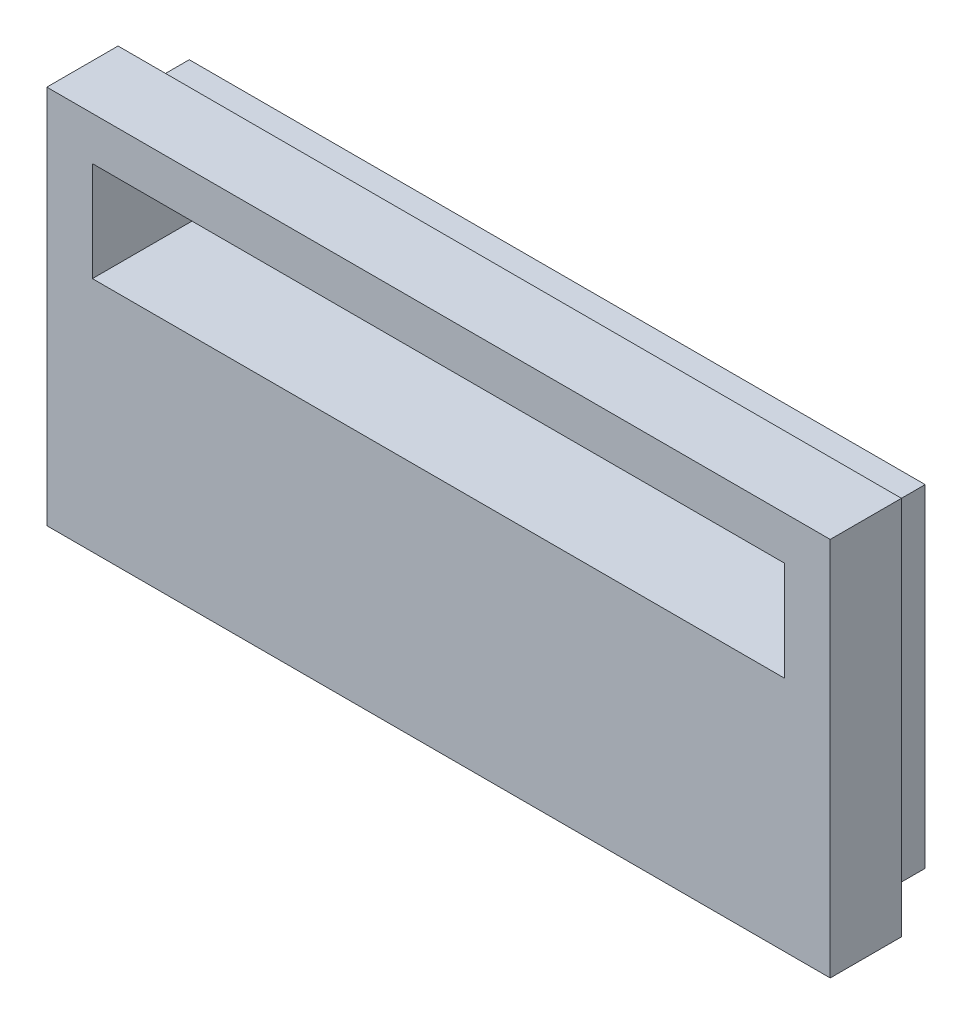
ISO-10303-21;
HEADER;
FILE_DESCRIPTION(('STEP AP214'),'2;1');
FILE_NAME('part.step','',(''),(''),'','','');
FILE_SCHEMA(('AUTOMOTIVE_DESIGN { 1 0 10303 214 1 1 1 1 }'));
ENDSEC;
DATA;
#1=APPLICATION_CONTEXT('core data for automotive mechanical design processes');
#2=APPLICATION_PROTOCOL_DEFINITION('international standard','automotive_design',2000,#1);
#3=PRODUCT_CONTEXT('',#1,'mechanical');
#4=PRODUCT('Part','Part','',(#3));
#5=PRODUCT_RELATED_PRODUCT_CATEGORY('part','',(#4));
#6=PRODUCT_DEFINITION_FORMATION('','',#4);
#7=PRODUCT_DEFINITION_CONTEXT('part definition',#1,'design');
#8=PRODUCT_DEFINITION('design','',#6,#7);
#9=PRODUCT_DEFINITION_SHAPE('','',#8);
#10=(LENGTH_UNIT() NAMED_UNIT(*) SI_UNIT(.MILLI.,.METRE.));
#11=(NAMED_UNIT(*) PLANE_ANGLE_UNIT() SI_UNIT($,.RADIAN.));
#12=(NAMED_UNIT(*) SI_UNIT($,.STERADIAN.) SOLID_ANGLE_UNIT());
#13=UNCERTAINTY_MEASURE_WITH_UNIT(LENGTH_MEASURE(1.E-05),#10,'distance_accuracy_value','');
#14=(GEOMETRIC_REPRESENTATION_CONTEXT(3) GLOBAL_UNCERTAINTY_ASSIGNED_CONTEXT((#13)) GLOBAL_UNIT_ASSIGNED_CONTEXT((#10,
#11,#12)) REPRESENTATION_CONTEXT('',''));
#15=CARTESIAN_POINT('',(0.,0.,0.));
#16=DIRECTION('',(0.,0.,1.));
#17=DIRECTION('',(1.,0.,0.));
#18=AXIS2_PLACEMENT_3D('',#15,#16,#17);
#19=CARTESIAN_POINT('',(8.25,-4.,1.5));
#20=DIRECTION('',(-1.,0.,0.));
#21=DIRECTION('',(0.,0.,1.));
#22=AXIS2_PLACEMENT_3D('',#19,#20,#21);
#23=PLANE('',#22);
#24=DIRECTION('',(0.,1.,0.));
#25=VECTOR('',#24,1.);
#26=CARTESIAN_POINT('',(8.25,-4.,0.));
#27=LINE('',#26,#25);
#28=CARTESIAN_POINT('',(8.25,-4.,0.));
#29=VERTEX_POINT('',#28);
#30=CARTESIAN_POINT('',(8.25,4.,0.));
#31=VERTEX_POINT('',#30);
#32=EDGE_CURVE('E191',#29,#31,#27,.T.);
#33=ORIENTED_EDGE('',*,*,#32,.T.);
#34=DIRECTION('',(0.,0.,-1.));
#35=VECTOR('',#34,1.);
#36=CARTESIAN_POINT('',(8.25,4.,1.5));
#37=LINE('',#36,#35);
#38=CARTESIAN_POINT('',(8.25,4.,1.5));
#39=VERTEX_POINT('',#38);
#40=EDGE_CURVE('E11',#39,#31,#37,.T.);
#41=ORIENTED_EDGE('',*,*,#40,.F.);
#42=DIRECTION('',(0.,1.,0.));
#43=VECTOR('',#42,1.);
#44=CARTESIAN_POINT('',(8.25,-4.,1.5));
#45=LINE('',#44,#43);
#46=CARTESIAN_POINT('',(8.25,-4.,1.5));
#47=VERTEX_POINT('',#46);
#48=EDGE_CURVE('E192',#47,#39,#45,.T.);
#49=ORIENTED_EDGE('',*,*,#48,.F.);
#50=DIRECTION('',(0.,0.,-1.));
#51=VECTOR('',#50,1.);
#52=CARTESIAN_POINT('',(8.25,-4.,1.5));
#53=LINE('',#52,#51);
#54=EDGE_CURVE('E202',#47,#29,#53,.T.);
#55=ORIENTED_EDGE('',*,*,#54,.T.);
#56=EDGE_LOOP('',(#33,#41,#49,#55));
#57=FACE_BOUND('',#56,.T.);
#58=ADVANCED_FACE('F33',(#57),#23,.F.);
#59=CARTESIAN_POINT('',(-8.25,4.,1.5));
#60=DIRECTION('',(0.,-1.,0.));
#61=DIRECTION('',(0.,0.,-1.));
#62=AXIS2_PLACEMENT_3D('',#59,#60,#61);
#63=PLANE('',#62);
#64=DIRECTION('',(-1.,0.,0.));
#65=VECTOR('',#64,1.);
#66=CARTESIAN_POINT('',(-8.25,4.,0.));
#67=LINE('',#66,#65);
#68=CARTESIAN_POINT('',(-8.25,4.,0.));
#69=VERTEX_POINT('',#68);
#70=EDGE_CURVE('E205',#31,#69,#67,.T.);
#71=ORIENTED_EDGE('',*,*,#70,.T.);
#72=DIRECTION('',(0.,0.,-1.));
#73=VECTOR('',#72,1.);
#74=CARTESIAN_POINT('',(-8.25,4.,1.5));
#75=LINE('',#74,#73);
#76=CARTESIAN_POINT('',(-8.25,4.,1.5));
#77=VERTEX_POINT('',#76);
#78=EDGE_CURVE('E40',#77,#69,#75,.T.);
#79=ORIENTED_EDGE('',*,*,#78,.F.);
#80=DIRECTION('',(-1.,0.,0.));
#81=VECTOR('',#80,1.);
#82=CARTESIAN_POINT('',(-8.25,4.,1.5));
#83=LINE('',#82,#81);
#84=EDGE_CURVE('E195',#39,#77,#83,.T.);
#85=ORIENTED_EDGE('',*,*,#84,.F.);
#86=ORIENTED_EDGE('',*,*,#40,.T.);
#87=EDGE_LOOP('',(#71,#79,#85,#86));
#88=FACE_BOUND('',#87,.T.);
#89=ADVANCED_FACE('F235',(#88),#63,.F.);
#90=CARTESIAN_POINT('',(-8.25,-4.,1.5));
#91=DIRECTION('',(1.,0.,0.));
#92=DIRECTION('',(0.,0.,-1.));
#93=AXIS2_PLACEMENT_3D('',#90,#91,#92);
#94=PLANE('',#93);
#95=DIRECTION('',(0.,-1.,0.));
#96=VECTOR('',#95,1.);
#97=CARTESIAN_POINT('',(-8.25,-4.,0.));
#98=LINE('',#97,#96);
#99=CARTESIAN_POINT('',(-8.25,-4.,0.));
#100=VERTEX_POINT('',#99);
#101=EDGE_CURVE('E207',#69,#100,#98,.T.);
#102=ORIENTED_EDGE('',*,*,#101,.T.);
#103=DIRECTION('',(0.,0.,-1.));
#104=VECTOR('',#103,1.);
#105=CARTESIAN_POINT('',(-8.25,-4.,1.5));
#106=LINE('',#105,#104);
#107=CARTESIAN_POINT('',(-8.25,-4.,1.5));
#108=VERTEX_POINT('',#107);
#109=EDGE_CURVE('E212',#108,#100,#106,.T.);
#110=ORIENTED_EDGE('',*,*,#109,.F.);
#111=DIRECTION('',(0.,-1.,0.));
#112=VECTOR('',#111,1.);
#113=CARTESIAN_POINT('',(-8.25,-4.,1.5));
#114=LINE('',#113,#112);
#115=EDGE_CURVE('E198',#77,#108,#114,.T.);
#116=ORIENTED_EDGE('',*,*,#115,.F.);
#117=ORIENTED_EDGE('',*,*,#78,.T.);
#118=EDGE_LOOP('',(#102,#110,#116,#117));
#119=FACE_BOUND('',#118,.T.);
#120=ADVANCED_FACE('F219',(#119),#94,.F.);
#121=CARTESIAN_POINT('',(-8.25,-4.,1.5));
#122=DIRECTION('',(0.,1.,0.));
#123=DIRECTION('',(0.,0.,1.));
#124=AXIS2_PLACEMENT_3D('',#121,#122,#123);
#125=PLANE('',#124);
#126=DIRECTION('',(1.,0.,0.));
#127=VECTOR('',#126,1.);
#128=CARTESIAN_POINT('',(-8.25,-4.,0.));
#129=LINE('',#128,#127);
#130=EDGE_CURVE('E196',#100,#29,#129,.T.);
#131=ORIENTED_EDGE('',*,*,#130,.T.);
#132=ORIENTED_EDGE('',*,*,#54,.F.);
#133=DIRECTION('',(1.,0.,0.));
#134=VECTOR('',#133,1.);
#135=CARTESIAN_POINT('',(-8.25,-4.,1.5));
#136=LINE('',#135,#134);
#137=EDGE_CURVE('E200',#108,#47,#136,.T.);
#138=ORIENTED_EDGE('',*,*,#137,.F.);
#139=ORIENTED_EDGE('',*,*,#109,.T.);
#140=EDGE_LOOP('',(#131,#132,#138,#139));
#141=FACE_BOUND('',#140,.T.);
#142=ADVANCED_FACE('F228',(#141),#125,.F.);
#143=CARTESIAN_POINT('',(0.,0.,1.5));
#144=DIRECTION('',(0.,0.,-1.));
#145=DIRECTION('',(-1.,0.,0.));
#146=AXIS2_PLACEMENT_3D('',#143,#144,#145);
#147=PLANE('',#146);
#148=DIRECTION('',(-1.,0.,0.));
#149=VECTOR('',#148,1.);
#150=CARTESIAN_POINT('',(0.,0.986831138523093,1.5));
#151=LINE('',#150,#149);
#152=CARTESIAN_POINT('',(7.29010390620659,0.986831138523093,1.5));
#153=VERTEX_POINT('',#152);
#154=CARTESIAN_POINT('',(-7.29010390620659,0.986831138523093,1.5));
#155=VERTEX_POINT('',#154);
#156=EDGE_CURVE('E152',#153,#155,#151,.T.);
#157=ORIENTED_EDGE('',*,*,#156,.T.);
#158=DIRECTION('',(0.,1.,0.));
#159=VECTOR('',#158,1.);
#160=CARTESIAN_POINT('',(-7.29010390620659,0.,1.5));
#161=LINE('',#160,#159);
#162=CARTESIAN_POINT('',(-7.29010390620659,3.08495860421182,1.5));
#163=VERTEX_POINT('',#162);
#164=EDGE_CURVE('E155',#155,#163,#161,.T.);
#165=ORIENTED_EDGE('',*,*,#164,.T.);
#166=DIRECTION('',(1.,0.,0.));
#167=VECTOR('',#166,1.);
#168=CARTESIAN_POINT('',(0.,3.08495860421182,1.5));
#169=LINE('',#168,#167);
#170=CARTESIAN_POINT('',(7.29010390620659,3.08495860421182,1.5));
#171=VERTEX_POINT('',#170);
#172=EDGE_CURVE('E147',#163,#171,#169,.T.);
#173=ORIENTED_EDGE('',*,*,#172,.T.);
#174=DIRECTION('',(0.,-1.,0.));
#175=VECTOR('',#174,1.);
#176=CARTESIAN_POINT('',(7.29010390620659,0.,1.5));
#177=LINE('',#176,#175);
#178=EDGE_CURVE('E127',#171,#153,#177,.T.);
#179=ORIENTED_EDGE('',*,*,#178,.T.);
#180=EDGE_LOOP('',(#157,#165,#173,#179));
#181=FACE_BOUND('',#180,.T.);
#182=ORIENTED_EDGE('',*,*,#48,.T.);
#183=ORIENTED_EDGE('',*,*,#84,.T.);
#184=ORIENTED_EDGE('',*,*,#115,.T.);
#185=ORIENTED_EDGE('',*,*,#137,.T.);
#186=EDGE_LOOP('',(#182,#183,#184,#185));
#187=FACE_BOUND('',#186,.T.);
#188=ADVANCED_FACE('F234',(#181,#187),#147,.F.);
#189=CARTESIAN_POINT('',(0.,0.,0.));
#190=DIRECTION('',(0.,0.,-1.));
#191=DIRECTION('',(-1.,0.,0.));
#192=AXIS2_PLACEMENT_3D('',#189,#190,#191);
#193=PLANE('',#192);
#194=DIRECTION('',(0.,1.,0.));
#195=VECTOR('',#194,1.);
#196=CARTESIAN_POINT('',(-7.75,-3.5,0.));
#197=LINE('',#196,#195);
#198=CARTESIAN_POINT('',(-7.75,-3.5,0.));
#199=VERTEX_POINT('',#198);
#200=CARTESIAN_POINT('',(-7.75,3.5,0.));
#201=VERTEX_POINT('',#200);
#202=EDGE_CURVE('E158',#199,#201,#197,.T.);
#203=ORIENTED_EDGE('',*,*,#202,.F.);
#204=DIRECTION('',(-1.,0.,0.));
#205=VECTOR('',#204,1.);
#206=CARTESIAN_POINT('',(7.75,-3.5,0.));
#207=LINE('',#206,#205);
#208=CARTESIAN_POINT('',(7.75,-3.5,0.));
#209=VERTEX_POINT('',#208);
#210=EDGE_CURVE('E163',#209,#199,#207,.T.);
#211=ORIENTED_EDGE('',*,*,#210,.F.);
#212=DIRECTION('',(0.,-1.,0.));
#213=VECTOR('',#212,1.);
#214=CARTESIAN_POINT('',(7.75,-3.5,0.));
#215=LINE('',#214,#213);
#216=CARTESIAN_POINT('',(7.75,3.5,0.));
#217=VERTEX_POINT('',#216);
#218=EDGE_CURVE('E175',#217,#209,#215,.T.);
#219=ORIENTED_EDGE('',*,*,#218,.F.);
#220=DIRECTION('',(1.,0.,0.));
#221=VECTOR('',#220,1.);
#222=CARTESIAN_POINT('',(7.75,3.5,0.));
#223=LINE('',#222,#221);
#224=EDGE_CURVE('E172',#201,#217,#223,.T.);
#225=ORIENTED_EDGE('',*,*,#224,.F.);
#226=EDGE_LOOP('',(#203,#211,#219,#225));
#227=FACE_BOUND('',#226,.T.);
#228=ORIENTED_EDGE('',*,*,#32,.F.);
#229=ORIENTED_EDGE('',*,*,#130,.F.);
#230=ORIENTED_EDGE('',*,*,#101,.F.);
#231=ORIENTED_EDGE('',*,*,#70,.F.);
#232=EDGE_LOOP('',(#228,#229,#230,#231));
#233=FACE_BOUND('',#232,.T.);
#234=ADVANCED_FACE('F225',(#227,#233),#193,.T.);
#235=CARTESIAN_POINT('',(-7.75,-3.5,-1.));
#236=DIRECTION('',(1.,0.,0.));
#237=DIRECTION('',(0.,0.,-1.));
#238=AXIS2_PLACEMENT_3D('',#235,#236,#237);
#239=PLANE('',#238);
#240=ORIENTED_EDGE('',*,*,#202,.T.);
#241=DIRECTION('',(0.,0.,1.));
#242=VECTOR('',#241,1.);
#243=CARTESIAN_POINT('',(-7.75,3.5,-1.));
#244=LINE('',#243,#242);
#245=CARTESIAN_POINT('',(-7.75,3.5,-1.));
#246=VERTEX_POINT('',#245);
#247=EDGE_CURVE('E188',#246,#201,#244,.T.);
#248=ORIENTED_EDGE('',*,*,#247,.F.);
#249=DIRECTION('',(0.,1.,0.));
#250=VECTOR('',#249,1.);
#251=CARTESIAN_POINT('',(-7.75,-3.5,-1.));
#252=LINE('',#251,#250);
#253=CARTESIAN_POINT('',(-7.75,-3.5,-1.));
#254=VERTEX_POINT('',#253);
#255=EDGE_CURVE('E159',#254,#246,#252,.T.);
#256=ORIENTED_EDGE('',*,*,#255,.F.);
#257=DIRECTION('',(0.,0.,1.));
#258=VECTOR('',#257,1.);
#259=CARTESIAN_POINT('',(-7.75,-3.5,-1.));
#260=LINE('',#259,#258);
#261=EDGE_CURVE('E169',#254,#199,#260,.T.);
#262=ORIENTED_EDGE('',*,*,#261,.T.);
#263=EDGE_LOOP('',(#240,#248,#256,#262));
#264=FACE_BOUND('',#263,.T.);
#265=ADVANCED_FACE('F247',(#264),#239,.F.);
#266=CARTESIAN_POINT('',(7.75,3.5,-1.));
#267=DIRECTION('',(0.,-1.,0.));
#268=DIRECTION('',(0.,0.,-1.));
#269=AXIS2_PLACEMENT_3D('',#266,#267,#268);
#270=PLANE('',#269);
#271=ORIENTED_EDGE('',*,*,#224,.T.);
#272=DIRECTION('',(0.,0.,1.));
#273=VECTOR('',#272,1.);
#274=CARTESIAN_POINT('',(7.75,3.5,-1.));
#275=LINE('',#274,#273);
#276=CARTESIAN_POINT('',(7.75,3.5,-1.));
#277=VERTEX_POINT('',#276);
#278=EDGE_CURVE('E185',#277,#217,#275,.T.);
#279=ORIENTED_EDGE('',*,*,#278,.F.);
#280=DIRECTION('',(1.,0.,0.));
#281=VECTOR('',#280,1.);
#282=CARTESIAN_POINT('',(7.75,3.5,-1.));
#283=LINE('',#282,#281);
#284=EDGE_CURVE('E162',#246,#277,#283,.T.);
#285=ORIENTED_EDGE('',*,*,#284,.F.);
#286=ORIENTED_EDGE('',*,*,#247,.T.);
#287=EDGE_LOOP('',(#271,#279,#285,#286));
#288=FACE_BOUND('',#287,.T.);
#289=ADVANCED_FACE('F254',(#288),#270,.F.);
#290=CARTESIAN_POINT('',(7.75,-3.5,-1.));
#291=DIRECTION('',(-1.,0.,0.));
#292=DIRECTION('',(0.,0.,1.));
#293=AXIS2_PLACEMENT_3D('',#290,#291,#292);
#294=PLANE('',#293);
#295=ORIENTED_EDGE('',*,*,#218,.T.);
#296=DIRECTION('',(0.,0.,1.));
#297=VECTOR('',#296,1.);
#298=CARTESIAN_POINT('',(7.75,-3.5,-1.));
#299=LINE('',#298,#297);
#300=CARTESIAN_POINT('',(7.75,-3.5,-1.));
#301=VERTEX_POINT('',#300);
#302=EDGE_CURVE('E182',#301,#209,#299,.T.);
#303=ORIENTED_EDGE('',*,*,#302,.F.);
#304=DIRECTION('',(0.,-1.,0.));
#305=VECTOR('',#304,1.);
#306=CARTESIAN_POINT('',(7.75,-3.5,-1.));
#307=LINE('',#306,#305);
#308=EDGE_CURVE('E165',#277,#301,#307,.T.);
#309=ORIENTED_EDGE('',*,*,#308,.F.);
#310=ORIENTED_EDGE('',*,*,#278,.T.);
#311=EDGE_LOOP('',(#295,#303,#309,#310));
#312=FACE_BOUND('',#311,.T.);
#313=ADVANCED_FACE('F258',(#312),#294,.F.);
#314=CARTESIAN_POINT('',(7.75,-3.5,-1.));
#315=DIRECTION('',(0.,1.,0.));
#316=DIRECTION('',(0.,0.,1.));
#317=AXIS2_PLACEMENT_3D('',#314,#315,#316);
#318=PLANE('',#317);
#319=ORIENTED_EDGE('',*,*,#210,.T.);
#320=ORIENTED_EDGE('',*,*,#261,.F.);
#321=DIRECTION('',(-1.,0.,0.));
#322=VECTOR('',#321,1.);
#323=CARTESIAN_POINT('',(7.75,-3.5,-1.));
#324=LINE('',#323,#322);
#325=EDGE_CURVE('E167',#301,#254,#324,.T.);
#326=ORIENTED_EDGE('',*,*,#325,.F.);
#327=ORIENTED_EDGE('',*,*,#302,.T.);
#328=EDGE_LOOP('',(#319,#320,#326,#327));
#329=FACE_BOUND('',#328,.T.);
#330=ADVANCED_FACE('F262',(#329),#318,.F.);
#331=CARTESIAN_POINT('',(0.,0.,-1.));
#332=DIRECTION('',(0.,0.,1.));
#333=DIRECTION('',(1.,0.,0.));
#334=AXIS2_PLACEMENT_3D('',#331,#332,#333);
#335=PLANE('',#334);
#336=DIRECTION('',(1.,0.,0.));
#337=VECTOR('',#336,1.);
#338=CARTESIAN_POINT('',(7.29010390620659,3.08495860421182,-1.));
#339=LINE('',#338,#337);
#340=CARTESIAN_POINT('',(-7.29010390620659,3.08495860421182,-1.));
#341=VERTEX_POINT('',#340);
#342=CARTESIAN_POINT('',(7.29010390620659,3.08495860421182,-1.));
#343=VERTEX_POINT('',#342);
#344=EDGE_CURVE('E133',#341,#343,#339,.T.);
#345=ORIENTED_EDGE('',*,*,#344,.F.);
#346=DIRECTION('',(0.,1.,0.));
#347=VECTOR('',#346,1.);
#348=CARTESIAN_POINT('',(-7.29010390620659,3.08495860421182,-1.));
#349=LINE('',#348,#347);
#350=CARTESIAN_POINT('',(-7.29010390620659,0.986831138523093,-1.));
#351=VERTEX_POINT('',#350);
#352=EDGE_CURVE('E55',#351,#341,#349,.T.);
#353=ORIENTED_EDGE('',*,*,#352,.F.);
#354=DIRECTION('',(-1.,0.,0.));
#355=VECTOR('',#354,1.);
#356=CARTESIAN_POINT('',(7.29010390620659,0.986831138523093,-1.));
#357=LINE('',#356,#355);
#358=CARTESIAN_POINT('',(7.29010390620659,0.986831138523093,-1.));
#359=VERTEX_POINT('',#358);
#360=EDGE_CURVE('E140',#359,#351,#357,.T.);
#361=ORIENTED_EDGE('',*,*,#360,.F.);
#362=DIRECTION('',(0.,-1.,0.));
#363=VECTOR('',#362,1.);
#364=CARTESIAN_POINT('',(7.29010390620659,3.08495860421182,-1.));
#365=LINE('',#364,#363);
#366=EDGE_CURVE('E124',#343,#359,#365,.T.);
#367=ORIENTED_EDGE('',*,*,#366,.F.);
#368=EDGE_LOOP('',(#345,#353,#361,#367));
#369=FACE_BOUND('',#368,.T.);
#370=ORIENTED_EDGE('',*,*,#255,.T.);
#371=ORIENTED_EDGE('',*,*,#284,.T.);
#372=ORIENTED_EDGE('',*,*,#308,.T.);
#373=ORIENTED_EDGE('',*,*,#325,.T.);
#374=EDGE_LOOP('',(#370,#371,#372,#373));
#375=FACE_BOUND('',#374,.T.);
#376=ADVANCED_FACE('F137',(#369,#375),#335,.F.);
#377=CARTESIAN_POINT('',(-7.29010390620659,3.08495860421182,4.));
#378=DIRECTION('',(-1.,0.,0.));
#379=DIRECTION('',(0.,0.,1.));
#380=AXIS2_PLACEMENT_3D('',#377,#378,#379);
#381=PLANE('',#380);
#382=DIRECTION('',(0.,0.,-1.));
#383=VECTOR('',#382,1.);
#384=CARTESIAN_POINT('',(-7.29010390620659,0.986831138523093,4.));
#385=LINE('',#384,#383);
#386=EDGE_CURVE('E145',#155,#351,#385,.T.);
#387=ORIENTED_EDGE('',*,*,#386,.T.);
#388=ORIENTED_EDGE('',*,*,#352,.T.);
#389=DIRECTION('',(0.,0.,-1.));
#390=VECTOR('',#389,1.);
#391=CARTESIAN_POINT('',(-7.29010390620659,3.08495860421182,4.));
#392=LINE('',#391,#390);
#393=EDGE_CURVE('E130',#163,#341,#392,.T.);
#394=ORIENTED_EDGE('',*,*,#393,.F.);
#395=ORIENTED_EDGE('',*,*,#164,.F.);
#396=EDGE_LOOP('',(#387,#388,#394,#395));
#397=FACE_BOUND('',#396,.T.);
#398=ADVANCED_FACE('F269',(#397),#381,.F.);
#399=CARTESIAN_POINT('',(7.29010390620659,0.986831138523093,4.));
#400=DIRECTION('',(0.,-1.,0.));
#401=DIRECTION('',(0.,0.,-1.));
#402=AXIS2_PLACEMENT_3D('',#399,#400,#401);
#403=PLANE('',#402);
#404=DIRECTION('',(0.,0.,-1.));
#405=VECTOR('',#404,1.);
#406=CARTESIAN_POINT('',(7.29010390620659,0.986831138523093,4.));
#407=LINE('',#406,#405);
#408=EDGE_CURVE('E129',#153,#359,#407,.T.);
#409=ORIENTED_EDGE('',*,*,#408,.T.);
#410=ORIENTED_EDGE('',*,*,#360,.T.);
#411=ORIENTED_EDGE('',*,*,#386,.F.);
#412=ORIENTED_EDGE('',*,*,#156,.F.);
#413=EDGE_LOOP('',(#409,#410,#411,#412));
#414=FACE_BOUND('',#413,.T.);
#415=ADVANCED_FACE('F272',(#414),#403,.F.);
#416=CARTESIAN_POINT('',(7.29010390620659,3.08495860421182,4.));
#417=DIRECTION('',(1.,0.,0.));
#418=DIRECTION('',(0.,0.,-1.));
#419=AXIS2_PLACEMENT_3D('',#416,#417,#418);
#420=PLANE('',#419);
#421=DIRECTION('',(0.,0.,-1.));
#422=VECTOR('',#421,1.);
#423=CARTESIAN_POINT('',(7.29010390620659,3.08495860421182,4.));
#424=LINE('',#423,#422);
#425=EDGE_CURVE('E47',#171,#343,#424,.T.);
#426=ORIENTED_EDGE('',*,*,#425,.T.);
#427=ORIENTED_EDGE('',*,*,#366,.T.);
#428=ORIENTED_EDGE('',*,*,#408,.F.);
#429=ORIENTED_EDGE('',*,*,#178,.F.);
#430=EDGE_LOOP('',(#426,#427,#428,#429));
#431=FACE_BOUND('',#430,.T.);
#432=ADVANCED_FACE('F121',(#431),#420,.F.);
#433=CARTESIAN_POINT('',(7.29010390620659,3.08495860421182,4.));
#434=DIRECTION('',(0.,1.,0.));
#435=DIRECTION('',(0.,0.,1.));
#436=AXIS2_PLACEMENT_3D('',#433,#434,#435);
#437=PLANE('',#436);
#438=ORIENTED_EDGE('',*,*,#393,.T.);
#439=ORIENTED_EDGE('',*,*,#344,.T.);
#440=ORIENTED_EDGE('',*,*,#425,.F.);
#441=ORIENTED_EDGE('',*,*,#172,.F.);
#442=EDGE_LOOP('',(#438,#439,#440,#441));
#443=FACE_BOUND('',#442,.T.);
#444=ADVANCED_FACE('F134',(#443),#437,.F.);
#445=CLOSED_SHELL('',(#58,#89,#120,#142,#188,#234,#265,#289,#313,#330,#376,#398,#415,#432,#444));
#446=MANIFOLD_SOLID_BREP('B2',#445);
#447=ADVANCED_BREP_SHAPE_REPRESENTATION('',(#18,#446),#14);
#448=SHAPE_DEFINITION_REPRESENTATION(#9,#447);
ENDSEC;
END-ISO-10303-21;
